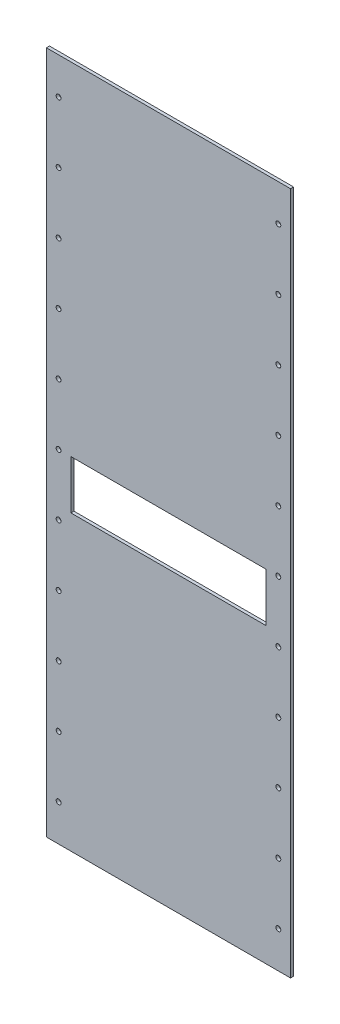
ISO-10303-21;
HEADER;
FILE_DESCRIPTION(('STEP AP214'),'2;1');
FILE_NAME('part.step','',(''),(''),'','','');
FILE_SCHEMA(('AUTOMOTIVE_DESIGN { 1 0 10303 214 1 1 1 1 }'));
ENDSEC;
DATA;
#1=APPLICATION_CONTEXT('core data for automotive mechanical design processes');
#2=APPLICATION_PROTOCOL_DEFINITION('international standard','automotive_design',2000,#1);
#3=PRODUCT_CONTEXT('',#1,'mechanical');
#4=PRODUCT('Part','Part','',(#3));
#5=PRODUCT_RELATED_PRODUCT_CATEGORY('part','',(#4));
#6=PRODUCT_DEFINITION_FORMATION('','',#4);
#7=PRODUCT_DEFINITION_CONTEXT('part definition',#1,'design');
#8=PRODUCT_DEFINITION('design','',#6,#7);
#9=PRODUCT_DEFINITION_SHAPE('','',#8);
#10=(LENGTH_UNIT() NAMED_UNIT(*) SI_UNIT(.MILLI.,.METRE.));
#11=(NAMED_UNIT(*) PLANE_ANGLE_UNIT() SI_UNIT($,.RADIAN.));
#12=(NAMED_UNIT(*) SI_UNIT($,.STERADIAN.) SOLID_ANGLE_UNIT());
#13=UNCERTAINTY_MEASURE_WITH_UNIT(LENGTH_MEASURE(1.E-05),#10,'distance_accuracy_value','');
#14=(GEOMETRIC_REPRESENTATION_CONTEXT(3) GLOBAL_UNCERTAINTY_ASSIGNED_CONTEXT((#13)) GLOBAL_UNIT_ASSIGNED_CONTEXT((#10,
#11,#12)) REPRESENTATION_CONTEXT('',''));
#15=CARTESIAN_POINT('',(0.,0.,0.));
#16=DIRECTION('',(0.,0.,1.));
#17=DIRECTION('',(1.,0.,0.));
#18=AXIS2_PLACEMENT_3D('',#15,#16,#17);
#19=CARTESIAN_POINT('',(-12.7,38.0999999999999,3.175));
#20=DIRECTION('',(0.,0.,1.));
#21=DIRECTION('',(1.,0.,0.));
#22=AXIS2_PLACEMENT_3D('',#19,#20,#21);
#23=CYLINDRICAL_SURFACE('',#22,2.55269999999999);
#24=CARTESIAN_POINT('',(-12.7,38.0999999999999,0.));
#25=DIRECTION('',(0.,0.,1.));
#26=DIRECTION('',(1.,0.,0.));
#27=AXIS2_PLACEMENT_3D('',#24,#25,#26);
#28=CIRCLE('',#27,2.55269999999999);
#29=CARTESIAN_POINT('',(-10.1473,38.0999999999999,0.));
#30=VERTEX_POINT('',#29);
#31=EDGE_CURVE('E46',#30,#30,#28,.F.);
#32=ORIENTED_EDGE('',*,*,#31,.T.);
#33=EDGE_LOOP('',(#32));
#34=FACE_BOUND('',#33,.T.);
#35=CARTESIAN_POINT('',(-12.7,38.0999999999999,3.175));
#36=DIRECTION('',(0.,0.,1.));
#37=DIRECTION('',(1.,0.,0.));
#38=AXIS2_PLACEMENT_3D('',#35,#36,#37);
#39=CIRCLE('',#38,2.55269999999999);
#40=CARTESIAN_POINT('',(-10.1473,38.0999999999999,3.175));
#41=VERTEX_POINT('',#40);
#42=EDGE_CURVE('E11',#41,#41,#39,.T.);
#43=ORIENTED_EDGE('',*,*,#42,.T.);
#44=EDGE_LOOP('',(#43));
#45=FACE_BOUND('',#44,.T.);
#46=ADVANCED_FACE('F38',(#34,#45),#23,.F.);
#47=CARTESIAN_POINT('',(-12.7,101.6,3.175));
#48=DIRECTION('',(0.,0.,1.));
#49=DIRECTION('',(1.,0.,0.));
#50=AXIS2_PLACEMENT_3D('',#47,#48,#49);
#51=CYLINDRICAL_SURFACE('',#50,2.55269999999999);
#52=CARTESIAN_POINT('',(-12.7,101.6,0.));
#53=DIRECTION('',(0.,0.,1.));
#54=DIRECTION('',(1.,0.,0.));
#55=AXIS2_PLACEMENT_3D('',#52,#53,#54);
#56=CIRCLE('',#55,2.55269999999999);
#57=CARTESIAN_POINT('',(-10.1473,101.6,0.));
#58=VERTEX_POINT('',#57);
#59=EDGE_CURVE('E353',#58,#58,#56,.F.);
#60=ORIENTED_EDGE('',*,*,#59,.T.);
#61=EDGE_LOOP('',(#60));
#62=FACE_BOUND('',#61,.T.);
#63=CARTESIAN_POINT('',(-12.7,101.6,3.175));
#64=DIRECTION('',(0.,0.,1.));
#65=DIRECTION('',(1.,0.,0.));
#66=AXIS2_PLACEMENT_3D('',#63,#64,#65);
#67=CIRCLE('',#66,2.55269999999999);
#68=CARTESIAN_POINT('',(-10.1473,101.6,3.175));
#69=VERTEX_POINT('',#68);
#70=EDGE_CURVE('E357',#69,#69,#67,.T.);
#71=ORIENTED_EDGE('',*,*,#70,.T.);
#72=EDGE_LOOP('',(#71));
#73=FACE_BOUND('',#72,.T.);
#74=ADVANCED_FACE('F388',(#62,#73),#51,.F.);
#75=CARTESIAN_POINT('',(-12.7,165.1,3.175));
#76=DIRECTION('',(0.,0.,1.));
#77=DIRECTION('',(1.,0.,0.));
#78=AXIS2_PLACEMENT_3D('',#75,#76,#77);
#79=CYLINDRICAL_SURFACE('',#78,2.55269999999999);
#80=CARTESIAN_POINT('',(-12.7,165.1,0.));
#81=DIRECTION('',(0.,0.,1.));
#82=DIRECTION('',(1.,0.,0.));
#83=AXIS2_PLACEMENT_3D('',#80,#81,#82);
#84=CIRCLE('',#83,2.55269999999999);
#85=CARTESIAN_POINT('',(-10.1473,165.1,0.));
#86=VERTEX_POINT('',#85);
#87=EDGE_CURVE('E345',#86,#86,#84,.F.);
#88=ORIENTED_EDGE('',*,*,#87,.T.);
#89=EDGE_LOOP('',(#88));
#90=FACE_BOUND('',#89,.T.);
#91=CARTESIAN_POINT('',(-12.7,165.1,3.175));
#92=DIRECTION('',(0.,0.,1.));
#93=DIRECTION('',(1.,0.,0.));
#94=AXIS2_PLACEMENT_3D('',#91,#92,#93);
#95=CIRCLE('',#94,2.55269999999999);
#96=CARTESIAN_POINT('',(-10.1473,165.1,3.175));
#97=VERTEX_POINT('',#96);
#98=EDGE_CURVE('E349',#97,#97,#95,.T.);
#99=ORIENTED_EDGE('',*,*,#98,.T.);
#100=EDGE_LOOP('',(#99));
#101=FACE_BOUND('',#100,.T.);
#102=ADVANCED_FACE('F392',(#90,#101),#79,.F.);
#103=CARTESIAN_POINT('',(-12.7,228.6,3.175));
#104=DIRECTION('',(0.,0.,1.));
#105=DIRECTION('',(1.,0.,0.));
#106=AXIS2_PLACEMENT_3D('',#103,#104,#105);
#107=CYLINDRICAL_SURFACE('',#106,2.55269999999999);
#108=CARTESIAN_POINT('',(-12.7,228.6,0.));
#109=DIRECTION('',(0.,0.,1.));
#110=DIRECTION('',(1.,0.,0.));
#111=AXIS2_PLACEMENT_3D('',#108,#109,#110);
#112=CIRCLE('',#111,2.55269999999999);
#113=CARTESIAN_POINT('',(-10.1473,228.6,0.));
#114=VERTEX_POINT('',#113);
#115=EDGE_CURVE('E337',#114,#114,#112,.F.);
#116=ORIENTED_EDGE('',*,*,#115,.T.);
#117=EDGE_LOOP('',(#116));
#118=FACE_BOUND('',#117,.T.);
#119=CARTESIAN_POINT('',(-12.7,228.6,3.175));
#120=DIRECTION('',(0.,0.,1.));
#121=DIRECTION('',(1.,0.,0.));
#122=AXIS2_PLACEMENT_3D('',#119,#120,#121);
#123=CIRCLE('',#122,2.55269999999999);
#124=CARTESIAN_POINT('',(-10.1473,228.6,3.175));
#125=VERTEX_POINT('',#124);
#126=EDGE_CURVE('E341',#125,#125,#123,.T.);
#127=ORIENTED_EDGE('',*,*,#126,.T.);
#128=EDGE_LOOP('',(#127));
#129=FACE_BOUND('',#128,.T.);
#130=ADVANCED_FACE('F397',(#118,#129),#107,.F.);
#131=CARTESIAN_POINT('',(-12.7,292.1,3.175));
#132=DIRECTION('',(0.,0.,1.));
#133=DIRECTION('',(1.,0.,0.));
#134=AXIS2_PLACEMENT_3D('',#131,#132,#133);
#135=CYLINDRICAL_SURFACE('',#134,2.55269999999999);
#136=CARTESIAN_POINT('',(-12.7,292.1,0.));
#137=DIRECTION('',(0.,0.,1.));
#138=DIRECTION('',(1.,0.,0.));
#139=AXIS2_PLACEMENT_3D('',#136,#137,#138);
#140=CIRCLE('',#139,2.55269999999999);
#141=CARTESIAN_POINT('',(-10.1473,292.1,0.));
#142=VERTEX_POINT('',#141);
#143=EDGE_CURVE('E329',#142,#142,#140,.F.);
#144=ORIENTED_EDGE('',*,*,#143,.T.);
#145=EDGE_LOOP('',(#144));
#146=FACE_BOUND('',#145,.T.);
#147=CARTESIAN_POINT('',(-12.7,292.1,3.175));
#148=DIRECTION('',(0.,0.,1.));
#149=DIRECTION('',(1.,0.,0.));
#150=AXIS2_PLACEMENT_3D('',#147,#148,#149);
#151=CIRCLE('',#150,2.55269999999999);
#152=CARTESIAN_POINT('',(-10.1473,292.1,3.175));
#153=VERTEX_POINT('',#152);
#154=EDGE_CURVE('E333',#153,#153,#151,.T.);
#155=ORIENTED_EDGE('',*,*,#154,.T.);
#156=EDGE_LOOP('',(#155));
#157=FACE_BOUND('',#156,.T.);
#158=ADVANCED_FACE('F404',(#146,#157),#135,.F.);
#159=CARTESIAN_POINT('',(-12.7,355.6,3.175));
#160=DIRECTION('',(0.,0.,1.));
#161=DIRECTION('',(1.,0.,0.));
#162=AXIS2_PLACEMENT_3D('',#159,#160,#161);
#163=CYLINDRICAL_SURFACE('',#162,2.55269999999999);
#164=CARTESIAN_POINT('',(-12.7,355.6,0.));
#165=DIRECTION('',(0.,0.,1.));
#166=DIRECTION('',(1.,0.,0.));
#167=AXIS2_PLACEMENT_3D('',#164,#165,#166);
#168=CIRCLE('',#167,2.55269999999999);
#169=CARTESIAN_POINT('',(-10.1473,355.6,0.));
#170=VERTEX_POINT('',#169);
#171=EDGE_CURVE('E321',#170,#170,#168,.F.);
#172=ORIENTED_EDGE('',*,*,#171,.T.);
#173=EDGE_LOOP('',(#172));
#174=FACE_BOUND('',#173,.T.);
#175=CARTESIAN_POINT('',(-12.7,355.6,3.175));
#176=DIRECTION('',(0.,0.,1.));
#177=DIRECTION('',(1.,0.,0.));
#178=AXIS2_PLACEMENT_3D('',#175,#176,#177);
#179=CIRCLE('',#178,2.55269999999999);
#180=CARTESIAN_POINT('',(-10.1473,355.6,3.175));
#181=VERTEX_POINT('',#180);
#182=EDGE_CURVE('E325',#181,#181,#179,.T.);
#183=ORIENTED_EDGE('',*,*,#182,.T.);
#184=EDGE_LOOP('',(#183));
#185=FACE_BOUND('',#184,.T.);
#186=ADVANCED_FACE('F408',(#174,#185),#163,.F.);
#187=CARTESIAN_POINT('',(-12.7,419.1,3.175));
#188=DIRECTION('',(0.,0.,1.));
#189=DIRECTION('',(1.,0.,0.));
#190=AXIS2_PLACEMENT_3D('',#187,#188,#189);
#191=CYLINDRICAL_SURFACE('',#190,2.55269999999999);
#192=CARTESIAN_POINT('',(-12.7,419.1,0.));
#193=DIRECTION('',(0.,0.,1.));
#194=DIRECTION('',(1.,0.,0.));
#195=AXIS2_PLACEMENT_3D('',#192,#193,#194);
#196=CIRCLE('',#195,2.55269999999999);
#197=CARTESIAN_POINT('',(-10.1473,419.1,0.));
#198=VERTEX_POINT('',#197);
#199=EDGE_CURVE('E313',#198,#198,#196,.F.);
#200=ORIENTED_EDGE('',*,*,#199,.T.);
#201=EDGE_LOOP('',(#200));
#202=FACE_BOUND('',#201,.T.);
#203=CARTESIAN_POINT('',(-12.7,419.1,3.175));
#204=DIRECTION('',(0.,0.,1.));
#205=DIRECTION('',(1.,0.,0.));
#206=AXIS2_PLACEMENT_3D('',#203,#204,#205);
#207=CIRCLE('',#206,2.55269999999999);
#208=CARTESIAN_POINT('',(-10.1473,419.1,3.175));
#209=VERTEX_POINT('',#208);
#210=EDGE_CURVE('E317',#209,#209,#207,.T.);
#211=ORIENTED_EDGE('',*,*,#210,.T.);
#212=EDGE_LOOP('',(#211));
#213=FACE_BOUND('',#212,.T.);
#214=ADVANCED_FACE('F412',(#202,#213),#191,.F.);
#215=CARTESIAN_POINT('',(-12.7,482.6,3.175));
#216=DIRECTION('',(0.,0.,1.));
#217=DIRECTION('',(1.,0.,0.));
#218=AXIS2_PLACEMENT_3D('',#215,#216,#217);
#219=CYLINDRICAL_SURFACE('',#218,2.55269999999999);
#220=CARTESIAN_POINT('',(-12.7,482.6,0.));
#221=DIRECTION('',(0.,0.,1.));
#222=DIRECTION('',(1.,0.,0.));
#223=AXIS2_PLACEMENT_3D('',#220,#221,#222);
#224=CIRCLE('',#223,2.55269999999999);
#225=CARTESIAN_POINT('',(-10.1473,482.6,0.));
#226=VERTEX_POINT('',#225);
#227=EDGE_CURVE('E305',#226,#226,#224,.F.);
#228=ORIENTED_EDGE('',*,*,#227,.T.);
#229=EDGE_LOOP('',(#228));
#230=FACE_BOUND('',#229,.T.);
#231=CARTESIAN_POINT('',(-12.7,482.6,3.175));
#232=DIRECTION('',(0.,0.,1.));
#233=DIRECTION('',(1.,0.,0.));
#234=AXIS2_PLACEMENT_3D('',#231,#232,#233);
#235=CIRCLE('',#234,2.55269999999999);
#236=CARTESIAN_POINT('',(-10.1473,482.6,3.175));
#237=VERTEX_POINT('',#236);
#238=EDGE_CURVE('E309',#237,#237,#235,.T.);
#239=ORIENTED_EDGE('',*,*,#238,.T.);
#240=EDGE_LOOP('',(#239));
#241=FACE_BOUND('',#240,.T.);
#242=ADVANCED_FACE('F416',(#230,#241),#219,.F.);
#243=CARTESIAN_POINT('',(-12.7,546.1,3.175));
#244=DIRECTION('',(0.,0.,1.));
#245=DIRECTION('',(1.,0.,0.));
#246=AXIS2_PLACEMENT_3D('',#243,#244,#245);
#247=CYLINDRICAL_SURFACE('',#246,2.55269999999999);
#248=CARTESIAN_POINT('',(-12.7,546.1,0.));
#249=DIRECTION('',(0.,0.,1.));
#250=DIRECTION('',(1.,0.,0.));
#251=AXIS2_PLACEMENT_3D('',#248,#249,#250);
#252=CIRCLE('',#251,2.55269999999999);
#253=CARTESIAN_POINT('',(-10.1473,546.1,0.));
#254=VERTEX_POINT('',#253);
#255=EDGE_CURVE('E297',#254,#254,#252,.F.);
#256=ORIENTED_EDGE('',*,*,#255,.T.);
#257=EDGE_LOOP('',(#256));
#258=FACE_BOUND('',#257,.T.);
#259=CARTESIAN_POINT('',(-12.7,546.1,3.175));
#260=DIRECTION('',(0.,0.,1.));
#261=DIRECTION('',(1.,0.,0.));
#262=AXIS2_PLACEMENT_3D('',#259,#260,#261);
#263=CIRCLE('',#262,2.55269999999999);
#264=CARTESIAN_POINT('',(-10.1473,546.1,3.175));
#265=VERTEX_POINT('',#264);
#266=EDGE_CURVE('E301',#265,#265,#263,.T.);
#267=ORIENTED_EDGE('',*,*,#266,.T.);
#268=EDGE_LOOP('',(#267));
#269=FACE_BOUND('',#268,.T.);
#270=ADVANCED_FACE('F420',(#258,#269),#247,.F.);
#271=CARTESIAN_POINT('',(-241.3,38.0999999999999,3.175));
#272=DIRECTION('',(0.,0.,1.));
#273=DIRECTION('',(1.,0.,0.));
#274=AXIS2_PLACEMENT_3D('',#271,#272,#273);
#275=CYLINDRICAL_SURFACE('',#274,2.55269999999999);
#276=CARTESIAN_POINT('',(-241.3,38.0999999999999,0.));
#277=DIRECTION('',(0.,0.,1.));
#278=DIRECTION('',(1.,0.,0.));
#279=AXIS2_PLACEMENT_3D('',#276,#277,#278);
#280=CIRCLE('',#279,2.55269999999999);
#281=CARTESIAN_POINT('',(-238.7473,38.0999999999999,0.));
#282=VERTEX_POINT('',#281);
#283=EDGE_CURVE('E289',#282,#282,#280,.F.);
#284=ORIENTED_EDGE('',*,*,#283,.T.);
#285=EDGE_LOOP('',(#284));
#286=FACE_BOUND('',#285,.T.);
#287=CARTESIAN_POINT('',(-241.3,38.0999999999999,3.175));
#288=DIRECTION('',(0.,0.,1.));
#289=DIRECTION('',(1.,0.,0.));
#290=AXIS2_PLACEMENT_3D('',#287,#288,#289);
#291=CIRCLE('',#290,2.55269999999999);
#292=CARTESIAN_POINT('',(-238.7473,38.0999999999999,3.175));
#293=VERTEX_POINT('',#292);
#294=EDGE_CURVE('E293',#293,#293,#291,.T.);
#295=ORIENTED_EDGE('',*,*,#294,.T.);
#296=EDGE_LOOP('',(#295));
#297=FACE_BOUND('',#296,.T.);
#298=ADVANCED_FACE('F424',(#286,#297),#275,.F.);
#299=CARTESIAN_POINT('',(-241.3,101.6,3.175));
#300=DIRECTION('',(0.,0.,1.));
#301=DIRECTION('',(1.,0.,0.));
#302=AXIS2_PLACEMENT_3D('',#299,#300,#301);
#303=CYLINDRICAL_SURFACE('',#302,2.55269999999999);
#304=CARTESIAN_POINT('',(-241.3,101.6,0.));
#305=DIRECTION('',(0.,0.,1.));
#306=DIRECTION('',(1.,0.,0.));
#307=AXIS2_PLACEMENT_3D('',#304,#305,#306);
#308=CIRCLE('',#307,2.55269999999999);
#309=CARTESIAN_POINT('',(-238.7473,101.6,0.));
#310=VERTEX_POINT('',#309);
#311=EDGE_CURVE('E281',#310,#310,#308,.F.);
#312=ORIENTED_EDGE('',*,*,#311,.T.);
#313=EDGE_LOOP('',(#312));
#314=FACE_BOUND('',#313,.T.);
#315=CARTESIAN_POINT('',(-241.3,101.6,3.175));
#316=DIRECTION('',(0.,0.,1.));
#317=DIRECTION('',(1.,0.,0.));
#318=AXIS2_PLACEMENT_3D('',#315,#316,#317);
#319=CIRCLE('',#318,2.55269999999999);
#320=CARTESIAN_POINT('',(-238.7473,101.6,3.175));
#321=VERTEX_POINT('',#320);
#322=EDGE_CURVE('E285',#321,#321,#319,.T.);
#323=ORIENTED_EDGE('',*,*,#322,.T.);
#324=EDGE_LOOP('',(#323));
#325=FACE_BOUND('',#324,.T.);
#326=ADVANCED_FACE('F428',(#314,#325),#303,.F.);
#327=CARTESIAN_POINT('',(-241.3,165.1,3.175));
#328=DIRECTION('',(0.,0.,1.));
#329=DIRECTION('',(1.,0.,0.));
#330=AXIS2_PLACEMENT_3D('',#327,#328,#329);
#331=CYLINDRICAL_SURFACE('',#330,2.55269999999999);
#332=CARTESIAN_POINT('',(-241.3,165.1,0.));
#333=DIRECTION('',(0.,0.,1.));
#334=DIRECTION('',(1.,0.,0.));
#335=AXIS2_PLACEMENT_3D('',#332,#333,#334);
#336=CIRCLE('',#335,2.55269999999999);
#337=CARTESIAN_POINT('',(-238.7473,165.1,0.));
#338=VERTEX_POINT('',#337);
#339=EDGE_CURVE('E273',#338,#338,#336,.F.);
#340=ORIENTED_EDGE('',*,*,#339,.T.);
#341=EDGE_LOOP('',(#340));
#342=FACE_BOUND('',#341,.T.);
#343=CARTESIAN_POINT('',(-241.3,165.1,3.175));
#344=DIRECTION('',(0.,0.,1.));
#345=DIRECTION('',(1.,0.,0.));
#346=AXIS2_PLACEMENT_3D('',#343,#344,#345);
#347=CIRCLE('',#346,2.55269999999999);
#348=CARTESIAN_POINT('',(-238.7473,165.1,3.175));
#349=VERTEX_POINT('',#348);
#350=EDGE_CURVE('E277',#349,#349,#347,.T.);
#351=ORIENTED_EDGE('',*,*,#350,.T.);
#352=EDGE_LOOP('',(#351));
#353=FACE_BOUND('',#352,.T.);
#354=ADVANCED_FACE('F432',(#342,#353),#331,.F.);
#355=CARTESIAN_POINT('',(-241.3,228.6,3.175));
#356=DIRECTION('',(0.,0.,1.));
#357=DIRECTION('',(1.,0.,0.));
#358=AXIS2_PLACEMENT_3D('',#355,#356,#357);
#359=CYLINDRICAL_SURFACE('',#358,2.55269999999999);
#360=CARTESIAN_POINT('',(-241.3,228.6,0.));
#361=DIRECTION('',(0.,0.,1.));
#362=DIRECTION('',(1.,0.,0.));
#363=AXIS2_PLACEMENT_3D('',#360,#361,#362);
#364=CIRCLE('',#363,2.55269999999999);
#365=CARTESIAN_POINT('',(-238.7473,228.6,0.));
#366=VERTEX_POINT('',#365);
#367=EDGE_CURVE('E265',#366,#366,#364,.F.);
#368=ORIENTED_EDGE('',*,*,#367,.T.);
#369=EDGE_LOOP('',(#368));
#370=FACE_BOUND('',#369,.T.);
#371=CARTESIAN_POINT('',(-241.3,228.6,3.175));
#372=DIRECTION('',(0.,0.,1.));
#373=DIRECTION('',(1.,0.,0.));
#374=AXIS2_PLACEMENT_3D('',#371,#372,#373);
#375=CIRCLE('',#374,2.55269999999999);
#376=CARTESIAN_POINT('',(-238.7473,228.6,3.175));
#377=VERTEX_POINT('',#376);
#378=EDGE_CURVE('E269',#377,#377,#375,.T.);
#379=ORIENTED_EDGE('',*,*,#378,.T.);
#380=EDGE_LOOP('',(#379));
#381=FACE_BOUND('',#380,.T.);
#382=ADVANCED_FACE('F436',(#370,#381),#359,.F.);
#383=CARTESIAN_POINT('',(-241.3,292.1,3.175));
#384=DIRECTION('',(0.,0.,1.));
#385=DIRECTION('',(1.,0.,0.));
#386=AXIS2_PLACEMENT_3D('',#383,#384,#385);
#387=CYLINDRICAL_SURFACE('',#386,2.55269999999999);
#388=CARTESIAN_POINT('',(-241.3,292.1,0.));
#389=DIRECTION('',(0.,0.,1.));
#390=DIRECTION('',(1.,0.,0.));
#391=AXIS2_PLACEMENT_3D('',#388,#389,#390);
#392=CIRCLE('',#391,2.55269999999999);
#393=CARTESIAN_POINT('',(-238.7473,292.1,0.));
#394=VERTEX_POINT('',#393);
#395=EDGE_CURVE('E257',#394,#394,#392,.F.);
#396=ORIENTED_EDGE('',*,*,#395,.T.);
#397=EDGE_LOOP('',(#396));
#398=FACE_BOUND('',#397,.T.);
#399=CARTESIAN_POINT('',(-241.3,292.1,3.175));
#400=DIRECTION('',(0.,0.,1.));
#401=DIRECTION('',(1.,0.,0.));
#402=AXIS2_PLACEMENT_3D('',#399,#400,#401);
#403=CIRCLE('',#402,2.55269999999999);
#404=CARTESIAN_POINT('',(-238.7473,292.1,3.175));
#405=VERTEX_POINT('',#404);
#406=EDGE_CURVE('E261',#405,#405,#403,.T.);
#407=ORIENTED_EDGE('',*,*,#406,.T.);
#408=EDGE_LOOP('',(#407));
#409=FACE_BOUND('',#408,.T.);
#410=ADVANCED_FACE('F440',(#398,#409),#387,.F.);
#411=CARTESIAN_POINT('',(-241.3,355.6,3.175));
#412=DIRECTION('',(0.,0.,1.));
#413=DIRECTION('',(1.,0.,0.));
#414=AXIS2_PLACEMENT_3D('',#411,#412,#413);
#415=CYLINDRICAL_SURFACE('',#414,2.55269999999999);
#416=CARTESIAN_POINT('',(-241.3,355.6,0.));
#417=DIRECTION('',(0.,0.,1.));
#418=DIRECTION('',(1.,0.,0.));
#419=AXIS2_PLACEMENT_3D('',#416,#417,#418);
#420=CIRCLE('',#419,2.55269999999999);
#421=CARTESIAN_POINT('',(-238.7473,355.6,0.));
#422=VERTEX_POINT('',#421);
#423=EDGE_CURVE('E249',#422,#422,#420,.F.);
#424=ORIENTED_EDGE('',*,*,#423,.T.);
#425=EDGE_LOOP('',(#424));
#426=FACE_BOUND('',#425,.T.);
#427=CARTESIAN_POINT('',(-241.3,355.6,3.175));
#428=DIRECTION('',(0.,0.,1.));
#429=DIRECTION('',(1.,0.,0.));
#430=AXIS2_PLACEMENT_3D('',#427,#428,#429);
#431=CIRCLE('',#430,2.55269999999999);
#432=CARTESIAN_POINT('',(-238.7473,355.6,3.175));
#433=VERTEX_POINT('',#432);
#434=EDGE_CURVE('E253',#433,#433,#431,.T.);
#435=ORIENTED_EDGE('',*,*,#434,.T.);
#436=EDGE_LOOP('',(#435));
#437=FACE_BOUND('',#436,.T.);
#438=ADVANCED_FACE('F444',(#426,#437),#415,.F.);
#439=CARTESIAN_POINT('',(-241.3,419.1,3.175));
#440=DIRECTION('',(0.,0.,1.));
#441=DIRECTION('',(1.,0.,0.));
#442=AXIS2_PLACEMENT_3D('',#439,#440,#441);
#443=CYLINDRICAL_SURFACE('',#442,2.55269999999999);
#444=CARTESIAN_POINT('',(-241.3,419.1,0.));
#445=DIRECTION('',(0.,0.,1.));
#446=DIRECTION('',(1.,0.,0.));
#447=AXIS2_PLACEMENT_3D('',#444,#445,#446);
#448=CIRCLE('',#447,2.55269999999999);
#449=CARTESIAN_POINT('',(-238.7473,419.1,0.));
#450=VERTEX_POINT('',#449);
#451=EDGE_CURVE('E241',#450,#450,#448,.F.);
#452=ORIENTED_EDGE('',*,*,#451,.T.);
#453=EDGE_LOOP('',(#452));
#454=FACE_BOUND('',#453,.T.);
#455=CARTESIAN_POINT('',(-241.3,419.1,3.175));
#456=DIRECTION('',(0.,0.,1.));
#457=DIRECTION('',(1.,0.,0.));
#458=AXIS2_PLACEMENT_3D('',#455,#456,#457);
#459=CIRCLE('',#458,2.55269999999999);
#460=CARTESIAN_POINT('',(-238.7473,419.1,3.175));
#461=VERTEX_POINT('',#460);
#462=EDGE_CURVE('E245',#461,#461,#459,.T.);
#463=ORIENTED_EDGE('',*,*,#462,.T.);
#464=EDGE_LOOP('',(#463));
#465=FACE_BOUND('',#464,.T.);
#466=ADVANCED_FACE('F448',(#454,#465),#443,.F.);
#467=CARTESIAN_POINT('',(-241.3,482.6,3.175));
#468=DIRECTION('',(0.,0.,1.));
#469=DIRECTION('',(1.,0.,0.));
#470=AXIS2_PLACEMENT_3D('',#467,#468,#469);
#471=CYLINDRICAL_SURFACE('',#470,2.55269999999999);
#472=CARTESIAN_POINT('',(-241.3,482.6,0.));
#473=DIRECTION('',(0.,0.,1.));
#474=DIRECTION('',(1.,0.,0.));
#475=AXIS2_PLACEMENT_3D('',#472,#473,#474);
#476=CIRCLE('',#475,2.55269999999999);
#477=CARTESIAN_POINT('',(-238.7473,482.6,0.));
#478=VERTEX_POINT('',#477);
#479=EDGE_CURVE('E233',#478,#478,#476,.F.);
#480=ORIENTED_EDGE('',*,*,#479,.T.);
#481=EDGE_LOOP('',(#480));
#482=FACE_BOUND('',#481,.T.);
#483=CARTESIAN_POINT('',(-241.3,482.6,3.175));
#484=DIRECTION('',(0.,0.,1.));
#485=DIRECTION('',(1.,0.,0.));
#486=AXIS2_PLACEMENT_3D('',#483,#484,#485);
#487=CIRCLE('',#486,2.55269999999999);
#488=CARTESIAN_POINT('',(-238.7473,482.6,3.175));
#489=VERTEX_POINT('',#488);
#490=EDGE_CURVE('E237',#489,#489,#487,.T.);
#491=ORIENTED_EDGE('',*,*,#490,.T.);
#492=EDGE_LOOP('',(#491));
#493=FACE_BOUND('',#492,.T.);
#494=ADVANCED_FACE('F381',(#482,#493),#471,.F.);
#495=CARTESIAN_POINT('',(-241.3,546.1,3.175));
#496=DIRECTION('',(0.,0.,1.));
#497=DIRECTION('',(1.,0.,0.));
#498=AXIS2_PLACEMENT_3D('',#495,#496,#497);
#499=CYLINDRICAL_SURFACE('',#498,2.55269999999999);
#500=CARTESIAN_POINT('',(-241.3,546.1,0.));
#501=DIRECTION('',(0.,0.,1.));
#502=DIRECTION('',(1.,0.,0.));
#503=AXIS2_PLACEMENT_3D('',#500,#501,#502);
#504=CIRCLE('',#503,2.55269999999999);
#505=CARTESIAN_POINT('',(-238.7473,546.1,0.));
#506=VERTEX_POINT('',#505);
#507=EDGE_CURVE('E225',#506,#506,#504,.F.);
#508=ORIENTED_EDGE('',*,*,#507,.T.);
#509=EDGE_LOOP('',(#508));
#510=FACE_BOUND('',#509,.T.);
#511=CARTESIAN_POINT('',(-241.3,546.1,3.175));
#512=DIRECTION('',(0.,0.,1.));
#513=DIRECTION('',(1.,0.,0.));
#514=AXIS2_PLACEMENT_3D('',#511,#512,#513);
#515=CIRCLE('',#514,2.55269999999999);
#516=CARTESIAN_POINT('',(-238.7473,546.1,3.175));
#517=VERTEX_POINT('',#516);
#518=EDGE_CURVE('E229',#517,#517,#515,.T.);
#519=ORIENTED_EDGE('',*,*,#518,.T.);
#520=EDGE_LOOP('',(#519));
#521=FACE_BOUND('',#520,.T.);
#522=ADVANCED_FACE('F369',(#510,#521),#499,.F.);
#523=CARTESIAN_POINT('',(0.,0.,0.));
#524=DIRECTION('',(0.,0.,1.));
#525=DIRECTION('',(1.,0.,0.));
#526=AXIS2_PLACEMENT_3D('',#523,#524,#525);
#527=PLANE('',#526);
#528=DIRECTION('',(-1.,0.,0.));
#529=VECTOR('',#528,1.);
#530=CARTESIAN_POINT('',(-25.4,304.8,0.));
#531=LINE('',#530,#529);
#532=CARTESIAN_POINT('',(-25.4,304.8,0.));
#533=VERTEX_POINT('',#532);
#534=CARTESIAN_POINT('',(-228.6,304.8,0.));
#535=VERTEX_POINT('',#534);
#536=EDGE_CURVE('E137',#533,#535,#531,.T.);
#537=ORIENTED_EDGE('',*,*,#536,.F.);
#538=DIRECTION('',(0.,-1.,0.));
#539=VECTOR('',#538,1.);
#540=CARTESIAN_POINT('',(-25.4,304.8,0.));
#541=LINE('',#540,#539);
#542=CARTESIAN_POINT('',(-25.4,355.6,0.));
#543=VERTEX_POINT('',#542);
#544=EDGE_CURVE('E53',#543,#533,#541,.T.);
#545=ORIENTED_EDGE('',*,*,#544,.F.);
#546=DIRECTION('',(1.,0.,0.));
#547=VECTOR('',#546,1.);
#548=CARTESIAN_POINT('',(-25.4,355.6,0.));
#549=LINE('',#548,#547);
#550=CARTESIAN_POINT('',(-228.6,355.6,0.));
#551=VERTEX_POINT('',#550);
#552=EDGE_CURVE('E124',#551,#543,#549,.T.);
#553=ORIENTED_EDGE('',*,*,#552,.F.);
#554=DIRECTION('',(0.,1.,0.));
#555=VECTOR('',#554,1.);
#556=CARTESIAN_POINT('',(-228.6,304.8,0.));
#557=LINE('',#556,#555);
#558=EDGE_CURVE('E128',#535,#551,#557,.T.);
#559=ORIENTED_EDGE('',*,*,#558,.F.);
#560=EDGE_LOOP('',(#537,#545,#553,#559));
#561=FACE_BOUND('',#560,.T.);
#562=CARTESIAN_POINT('',(-12.7,609.6,0.));
#563=DIRECTION('',(0.,0.,1.));
#564=DIRECTION('',(1.,0.,0.));
#565=AXIS2_PLACEMENT_3D('',#562,#563,#564);
#566=CIRCLE('',#565,2.55269999999999);
#567=CARTESIAN_POINT('',(-10.1473,609.6,0.));
#568=VERTEX_POINT('',#567);
#569=EDGE_CURVE('E146',#568,#568,#566,.F.);
#570=ORIENTED_EDGE('',*,*,#569,.F.);
#571=EDGE_LOOP('',(#570));
#572=FACE_BOUND('',#571,.T.);
#573=CARTESIAN_POINT('',(-241.3,609.6,0.));
#574=DIRECTION('',(0.,0.,1.));
#575=DIRECTION('',(1.,0.,0.));
#576=AXIS2_PLACEMENT_3D('',#573,#574,#575);
#577=CIRCLE('',#576,2.55269999999999);
#578=CARTESIAN_POINT('',(-238.7473,609.6,0.));
#579=VERTEX_POINT('',#578);
#580=EDGE_CURVE('E159',#579,#579,#577,.F.);
#581=ORIENTED_EDGE('',*,*,#580,.F.);
#582=EDGE_LOOP('',(#581));
#583=FACE_BOUND('',#582,.T.);
#584=CARTESIAN_POINT('',(-12.7,673.1,0.));
#585=DIRECTION('',(0.,0.,1.));
#586=DIRECTION('',(1.,0.,0.));
#587=AXIS2_PLACEMENT_3D('',#584,#585,#586);
#588=CIRCLE('',#587,2.55269999999999);
#589=CARTESIAN_POINT('',(-10.1473,673.1,0.));
#590=VERTEX_POINT('',#589);
#591=EDGE_CURVE('E176',#590,#590,#588,.F.);
#592=ORIENTED_EDGE('',*,*,#591,.F.);
#593=EDGE_LOOP('',(#592));
#594=FACE_BOUND('',#593,.T.);
#595=DIRECTION('',(0.,1.,0.));
#596=VECTOR('',#595,1.);
#597=CARTESIAN_POINT('',(0.,0.,0.));
#598=LINE('',#597,#596);
#599=CARTESIAN_POINT('',(0.,0.,0.));
#600=VERTEX_POINT('',#599);
#601=CARTESIAN_POINT('',(0.,711.2,0.));
#602=VERTEX_POINT('',#601);
#603=EDGE_CURVE('E180',#600,#602,#598,.T.);
#604=ORIENTED_EDGE('',*,*,#603,.F.);
#605=DIRECTION('',(1.,0.,0.));
#606=VECTOR('',#605,1.);
#607=CARTESIAN_POINT('',(0.,0.,0.));
#608=LINE('',#607,#606);
#609=CARTESIAN_POINT('',(-254.,0.,0.));
#610=VERTEX_POINT('',#609);
#611=EDGE_CURVE('E189',#610,#600,#608,.T.);
#612=ORIENTED_EDGE('',*,*,#611,.F.);
#613=DIRECTION('',(0.,-1.,0.));
#614=VECTOR('',#613,1.);
#615=CARTESIAN_POINT('',(-254.,0.,0.));
#616=LINE('',#615,#614);
#617=CARTESIAN_POINT('',(-254.,711.2,0.));
#618=VERTEX_POINT('',#617);
#619=EDGE_CURVE('E205',#618,#610,#616,.T.);
#620=ORIENTED_EDGE('',*,*,#619,.F.);
#621=DIRECTION('',(-1.,0.,0.));
#622=VECTOR('',#621,1.);
#623=CARTESIAN_POINT('',(0.,711.2,0.));
#624=LINE('',#623,#622);
#625=EDGE_CURVE('E202',#602,#618,#624,.T.);
#626=ORIENTED_EDGE('',*,*,#625,.F.);
#627=EDGE_LOOP('',(#604,#612,#620,#626));
#628=FACE_BOUND('',#627,.T.);
#629=CARTESIAN_POINT('',(-241.3,673.1,0.));
#630=DIRECTION('',(0.,0.,1.));
#631=DIRECTION('',(1.,0.,0.));
#632=AXIS2_PLACEMENT_3D('',#629,#630,#631);
#633=CIRCLE('',#632,2.55269999999999);
#634=CARTESIAN_POINT('',(-238.7473,673.1,0.));
#635=VERTEX_POINT('',#634);
#636=EDGE_CURVE('E168',#635,#635,#633,.F.);
#637=ORIENTED_EDGE('',*,*,#636,.F.);
#638=EDGE_LOOP('',(#637));
#639=FACE_BOUND('',#638,.T.);
#640=ORIENTED_EDGE('',*,*,#507,.F.);
#641=EDGE_LOOP('',(#640));
#642=FACE_BOUND('',#641,.T.);
#643=ORIENTED_EDGE('',*,*,#479,.F.);
#644=EDGE_LOOP('',(#643));
#645=FACE_BOUND('',#644,.T.);
#646=ORIENTED_EDGE('',*,*,#451,.F.);
#647=EDGE_LOOP('',(#646));
#648=FACE_BOUND('',#647,.T.);
#649=ORIENTED_EDGE('',*,*,#423,.F.);
#650=EDGE_LOOP('',(#649));
#651=FACE_BOUND('',#650,.T.);
#652=ORIENTED_EDGE('',*,*,#395,.F.);
#653=EDGE_LOOP('',(#652));
#654=FACE_BOUND('',#653,.T.);
#655=ORIENTED_EDGE('',*,*,#367,.F.);
#656=EDGE_LOOP('',(#655));
#657=FACE_BOUND('',#656,.T.);
#658=ORIENTED_EDGE('',*,*,#339,.F.);
#659=EDGE_LOOP('',(#658));
#660=FACE_BOUND('',#659,.T.);
#661=ORIENTED_EDGE('',*,*,#311,.F.);
#662=EDGE_LOOP('',(#661));
#663=FACE_BOUND('',#662,.T.);
#664=ORIENTED_EDGE('',*,*,#283,.F.);
#665=EDGE_LOOP('',(#664));
#666=FACE_BOUND('',#665,.T.);
#667=ORIENTED_EDGE('',*,*,#255,.F.);
#668=EDGE_LOOP('',(#667));
#669=FACE_BOUND('',#668,.T.);
#670=ORIENTED_EDGE('',*,*,#227,.F.);
#671=EDGE_LOOP('',(#670));
#672=FACE_BOUND('',#671,.T.);
#673=ORIENTED_EDGE('',*,*,#199,.F.);
#674=EDGE_LOOP('',(#673));
#675=FACE_BOUND('',#674,.T.);
#676=ORIENTED_EDGE('',*,*,#171,.F.);
#677=EDGE_LOOP('',(#676));
#678=FACE_BOUND('',#677,.T.);
#679=ORIENTED_EDGE('',*,*,#143,.F.);
#680=EDGE_LOOP('',(#679));
#681=FACE_BOUND('',#680,.T.);
#682=ORIENTED_EDGE('',*,*,#115,.F.);
#683=EDGE_LOOP('',(#682));
#684=FACE_BOUND('',#683,.T.);
#685=ORIENTED_EDGE('',*,*,#87,.F.);
#686=EDGE_LOOP('',(#685));
#687=FACE_BOUND('',#686,.T.);
#688=ORIENTED_EDGE('',*,*,#59,.F.);
#689=EDGE_LOOP('',(#688));
#690=FACE_BOUND('',#689,.T.);
#691=ORIENTED_EDGE('',*,*,#31,.F.);
#692=EDGE_LOOP('',(#691));
#693=FACE_BOUND('',#692,.T.);
#694=ADVANCED_FACE('F366',(#561,#572,#583,#594,#628,#639,#642,#645,#648,#651,#654,#657,#660,
#663,#666,#669,#672,#675,#678,#681,#684,#687,#690,#693),#527,.F.);
#695=CARTESIAN_POINT('',(0.,0.,3.175));
#696=DIRECTION('',(-1.,0.,0.));
#697=DIRECTION('',(0.,0.,1.));
#698=AXIS2_PLACEMENT_3D('',#695,#696,#697);
#699=PLANE('',#698);
#700=ORIENTED_EDGE('',*,*,#603,.T.);
#701=DIRECTION('',(0.,0.,-1.));
#702=VECTOR('',#701,1.);
#703=CARTESIAN_POINT('',(0.,711.2,3.175));
#704=LINE('',#703,#702);
#705=CARTESIAN_POINT('',(0.,711.2,3.175));
#706=VERTEX_POINT('',#705);
#707=EDGE_CURVE('E221',#706,#602,#704,.T.);
#708=ORIENTED_EDGE('',*,*,#707,.F.);
#709=DIRECTION('',(0.,1.,0.));
#710=VECTOR('',#709,1.);
#711=CARTESIAN_POINT('',(0.,0.,3.175));
#712=LINE('',#711,#710);
#713=CARTESIAN_POINT('',(0.,0.,3.175));
#714=VERTEX_POINT('',#713);
#715=EDGE_CURVE('E184',#714,#706,#712,.T.);
#716=ORIENTED_EDGE('',*,*,#715,.F.);
#717=DIRECTION('',(0.,0.,-1.));
#718=VECTOR('',#717,1.);
#719=CARTESIAN_POINT('',(0.,0.,3.175));
#720=LINE('',#719,#718);
#721=EDGE_CURVE('E198',#714,#600,#720,.T.);
#722=ORIENTED_EDGE('',*,*,#721,.T.);
#723=EDGE_LOOP('',(#700,#708,#716,#722));
#724=FACE_BOUND('',#723,.T.);
#725=ADVANCED_FACE('F368',(#724),#699,.F.);
#726=CARTESIAN_POINT('',(0.,711.2,3.175));
#727=DIRECTION('',(0.,-1.,0.));
#728=DIRECTION('',(1.,0.,0.));
#729=AXIS2_PLACEMENT_3D('',#726,#727,#728);
#730=PLANE('',#729);
#731=ORIENTED_EDGE('',*,*,#625,.T.);
#732=DIRECTION('',(0.,0.,-1.));
#733=VECTOR('',#732,1.);
#734=CARTESIAN_POINT('',(-254.,711.2,3.175));
#735=LINE('',#734,#733);
#736=CARTESIAN_POINT('',(-254.,711.2,3.175));
#737=VERTEX_POINT('',#736);
#738=EDGE_CURVE('E217',#737,#618,#735,.T.);
#739=ORIENTED_EDGE('',*,*,#738,.F.);
#740=DIRECTION('',(-1.,0.,0.));
#741=VECTOR('',#740,1.);
#742=CARTESIAN_POINT('',(0.,711.2,3.175));
#743=LINE('',#742,#741);
#744=EDGE_CURVE('E188',#706,#737,#743,.T.);
#745=ORIENTED_EDGE('',*,*,#744,.F.);
#746=ORIENTED_EDGE('',*,*,#707,.T.);
#747=EDGE_LOOP('',(#731,#739,#745,#746));
#748=FACE_BOUND('',#747,.T.);
#749=ADVANCED_FACE('F377',(#748),#730,.F.);
#750=CARTESIAN_POINT('',(-254.,0.,3.175));
#751=DIRECTION('',(1.,0.,0.));
#752=DIRECTION('',(0.,0.,-1.));
#753=AXIS2_PLACEMENT_3D('',#750,#751,#752);
#754=PLANE('',#753);
#755=ORIENTED_EDGE('',*,*,#619,.T.);
#756=DIRECTION('',(0.,0.,-1.));
#757=VECTOR('',#756,1.);
#758=CARTESIAN_POINT('',(-254.,0.,3.175));
#759=LINE('',#758,#757);
#760=CARTESIAN_POINT('',(-254.,0.,3.175));
#761=VERTEX_POINT('',#760);
#762=EDGE_CURVE('E213',#761,#610,#759,.T.);
#763=ORIENTED_EDGE('',*,*,#762,.F.);
#764=DIRECTION('',(0.,-1.,0.));
#765=VECTOR('',#764,1.);
#766=CARTESIAN_POINT('',(-254.,0.,3.175));
#767=LINE('',#766,#765);
#768=EDGE_CURVE('E192',#737,#761,#767,.T.);
#769=ORIENTED_EDGE('',*,*,#768,.F.);
#770=ORIENTED_EDGE('',*,*,#738,.T.);
#771=EDGE_LOOP('',(#755,#763,#769,#770));
#772=FACE_BOUND('',#771,.T.);
#773=ADVANCED_FACE('F458',(#772),#754,.F.);
#774=CARTESIAN_POINT('',(0.,0.,3.175));
#775=DIRECTION('',(0.,1.,0.));
#776=DIRECTION('',(0.,0.,1.));
#777=AXIS2_PLACEMENT_3D('',#774,#775,#776);
#778=PLANE('',#777);
#779=ORIENTED_EDGE('',*,*,#611,.T.);
#780=ORIENTED_EDGE('',*,*,#721,.F.);
#781=DIRECTION('',(1.,0.,0.));
#782=VECTOR('',#781,1.);
#783=CARTESIAN_POINT('',(0.,0.,3.175));
#784=LINE('',#783,#782);
#785=EDGE_CURVE('E195',#761,#714,#784,.T.);
#786=ORIENTED_EDGE('',*,*,#785,.F.);
#787=ORIENTED_EDGE('',*,*,#762,.T.);
#788=EDGE_LOOP('',(#779,#780,#786,#787));
#789=FACE_BOUND('',#788,.T.);
#790=ADVANCED_FACE('F461',(#789),#778,.F.);
#791=CARTESIAN_POINT('',(0.,0.,3.175));
#792=DIRECTION('',(0.,0.,1.));
#793=DIRECTION('',(1.,0.,0.));
#794=AXIS2_PLACEMENT_3D('',#791,#792,#793);
#795=PLANE('',#794);
#796=DIRECTION('',(0.,-1.,0.));
#797=VECTOR('',#796,1.);
#798=CARTESIAN_POINT('',(-25.4,304.8,3.175));
#799=LINE('',#798,#797);
#800=CARTESIAN_POINT('',(-25.4,355.6,3.175));
#801=VERTEX_POINT('',#800);
#802=CARTESIAN_POINT('',(-25.4,304.8,3.175));
#803=VERTEX_POINT('',#802);
#804=EDGE_CURVE('E105',#801,#803,#799,.T.);
#805=ORIENTED_EDGE('',*,*,#804,.T.);
#806=DIRECTION('',(-1.,0.,0.));
#807=VECTOR('',#806,1.);
#808=CARTESIAN_POINT('',(-25.4,304.8,3.175));
#809=LINE('',#808,#807);
#810=CARTESIAN_POINT('',(-228.6,304.8,3.175));
#811=VERTEX_POINT('',#810);
#812=EDGE_CURVE('E115',#803,#811,#809,.T.);
#813=ORIENTED_EDGE('',*,*,#812,.T.);
#814=DIRECTION('',(0.,1.,0.));
#815=VECTOR('',#814,1.);
#816=CARTESIAN_POINT('',(-228.6,304.8,3.175));
#817=LINE('',#816,#815);
#818=CARTESIAN_POINT('',(-228.6,355.6,3.175));
#819=VERTEX_POINT('',#818);
#820=EDGE_CURVE('E61',#811,#819,#817,.T.);
#821=ORIENTED_EDGE('',*,*,#820,.T.);
#822=DIRECTION('',(1.,0.,0.));
#823=VECTOR('',#822,1.);
#824=CARTESIAN_POINT('',(-25.4,355.6,3.175));
#825=LINE('',#824,#823);
#826=EDGE_CURVE('E112',#819,#801,#825,.T.);
#827=ORIENTED_EDGE('',*,*,#826,.T.);
#828=EDGE_LOOP('',(#805,#813,#821,#827));
#829=FACE_BOUND('',#828,.T.);
#830=CARTESIAN_POINT('',(-12.7,609.6,3.175));
#831=DIRECTION('',(0.,0.,1.));
#832=DIRECTION('',(1.,0.,0.));
#833=AXIS2_PLACEMENT_3D('',#830,#831,#832);
#834=CIRCLE('',#833,2.55269999999999);
#835=CARTESIAN_POINT('',(-10.1473,609.6,3.175));
#836=VERTEX_POINT('',#835);
#837=EDGE_CURVE('E155',#836,#836,#834,.T.);
#838=ORIENTED_EDGE('',*,*,#837,.F.);
#839=EDGE_LOOP('',(#838));
#840=FACE_BOUND('',#839,.T.);
#841=CARTESIAN_POINT('',(-241.3,609.6,3.175));
#842=DIRECTION('',(0.,0.,1.));
#843=DIRECTION('',(1.,0.,0.));
#844=AXIS2_PLACEMENT_3D('',#841,#842,#843);
#845=CIRCLE('',#844,2.55269999999999);
#846=CARTESIAN_POINT('',(-238.7473,609.6,3.175));
#847=VERTEX_POINT('',#846);
#848=EDGE_CURVE('E163',#847,#847,#845,.T.);
#849=ORIENTED_EDGE('',*,*,#848,.F.);
#850=EDGE_LOOP('',(#849));
#851=FACE_BOUND('',#850,.T.);
#852=CARTESIAN_POINT('',(-241.3,673.1,3.175));
#853=DIRECTION('',(0.,0.,1.));
#854=DIRECTION('',(1.,0.,0.));
#855=AXIS2_PLACEMENT_3D('',#852,#853,#854);
#856=CIRCLE('',#855,2.55269999999999);
#857=CARTESIAN_POINT('',(-238.7473,673.1,3.175));
#858=VERTEX_POINT('',#857);
#859=EDGE_CURVE('E167',#858,#858,#856,.T.);
#860=ORIENTED_EDGE('',*,*,#859,.F.);
#861=EDGE_LOOP('',(#860));
#862=FACE_BOUND('',#861,.T.);
#863=CARTESIAN_POINT('',(-12.7,673.1,3.175));
#864=DIRECTION('',(0.,0.,1.));
#865=DIRECTION('',(1.,0.,0.));
#866=AXIS2_PLACEMENT_3D('',#863,#864,#865);
#867=CIRCLE('',#866,2.55269999999999);
#868=CARTESIAN_POINT('',(-10.1473,673.1,3.175));
#869=VERTEX_POINT('',#868);
#870=EDGE_CURVE('E172',#869,#869,#867,.T.);
#871=ORIENTED_EDGE('',*,*,#870,.F.);
#872=EDGE_LOOP('',(#871));
#873=FACE_BOUND('',#872,.T.);
#874=ORIENTED_EDGE('',*,*,#715,.T.);
#875=ORIENTED_EDGE('',*,*,#744,.T.);
#876=ORIENTED_EDGE('',*,*,#768,.T.);
#877=ORIENTED_EDGE('',*,*,#785,.T.);
#878=EDGE_LOOP('',(#874,#875,#876,#877));
#879=FACE_BOUND('',#878,.T.);
#880=ORIENTED_EDGE('',*,*,#518,.F.);
#881=EDGE_LOOP('',(#880));
#882=FACE_BOUND('',#881,.T.);
#883=ORIENTED_EDGE('',*,*,#490,.F.);
#884=EDGE_LOOP('',(#883));
#885=FACE_BOUND('',#884,.T.);
#886=ORIENTED_EDGE('',*,*,#462,.F.);
#887=EDGE_LOOP('',(#886));
#888=FACE_BOUND('',#887,.T.);
#889=ORIENTED_EDGE('',*,*,#434,.F.);
#890=EDGE_LOOP('',(#889));
#891=FACE_BOUND('',#890,.T.);
#892=ORIENTED_EDGE('',*,*,#406,.F.);
#893=EDGE_LOOP('',(#892));
#894=FACE_BOUND('',#893,.T.);
#895=ORIENTED_EDGE('',*,*,#378,.F.);
#896=EDGE_LOOP('',(#895));
#897=FACE_BOUND('',#896,.T.);
#898=ORIENTED_EDGE('',*,*,#350,.F.);
#899=EDGE_LOOP('',(#898));
#900=FACE_BOUND('',#899,.T.);
#901=ORIENTED_EDGE('',*,*,#322,.F.);
#902=EDGE_LOOP('',(#901));
#903=FACE_BOUND('',#902,.T.);
#904=ORIENTED_EDGE('',*,*,#294,.F.);
#905=EDGE_LOOP('',(#904));
#906=FACE_BOUND('',#905,.T.);
#907=ORIENTED_EDGE('',*,*,#266,.F.);
#908=EDGE_LOOP('',(#907));
#909=FACE_BOUND('',#908,.T.);
#910=ORIENTED_EDGE('',*,*,#238,.F.);
#911=EDGE_LOOP('',(#910));
#912=FACE_BOUND('',#911,.T.);
#913=ORIENTED_EDGE('',*,*,#210,.F.);
#914=EDGE_LOOP('',(#913));
#915=FACE_BOUND('',#914,.T.);
#916=ORIENTED_EDGE('',*,*,#182,.F.);
#917=EDGE_LOOP('',(#916));
#918=FACE_BOUND('',#917,.T.);
#919=ORIENTED_EDGE('',*,*,#154,.F.);
#920=EDGE_LOOP('',(#919));
#921=FACE_BOUND('',#920,.T.);
#922=ORIENTED_EDGE('',*,*,#126,.F.);
#923=EDGE_LOOP('',(#922));
#924=FACE_BOUND('',#923,.T.);
#925=ORIENTED_EDGE('',*,*,#98,.F.);
#926=EDGE_LOOP('',(#925));
#927=FACE_BOUND('',#926,.T.);
#928=ORIENTED_EDGE('',*,*,#70,.F.);
#929=EDGE_LOOP('',(#928));
#930=FACE_BOUND('',#929,.T.);
#931=ORIENTED_EDGE('',*,*,#42,.F.);
#932=EDGE_LOOP('',(#931));
#933=FACE_BOUND('',#932,.T.);
#934=ADVANCED_FACE('F120',(#829,#840,#851,#862,#873,#879,#882,#885,#888,#891,#894,#897,#900,
#903,#906,#909,#912,#915,#918,#921,#924,#927,#930,#933),#795,.T.);
#935=CARTESIAN_POINT('',(-12.7,673.1,3.175));
#936=DIRECTION('',(0.,0.,1.));
#937=DIRECTION('',(1.,0.,0.));
#938=AXIS2_PLACEMENT_3D('',#935,#936,#937);
#939=CYLINDRICAL_SURFACE('',#938,2.55269999999999);
#940=ORIENTED_EDGE('',*,*,#591,.T.);
#941=EDGE_LOOP('',(#940));
#942=FACE_BOUND('',#941,.T.);
#943=ORIENTED_EDGE('',*,*,#870,.T.);
#944=EDGE_LOOP('',(#943));
#945=FACE_BOUND('',#944,.T.);
#946=ADVANCED_FACE('F468',(#942,#945),#939,.F.);
#947=CARTESIAN_POINT('',(-241.3,673.1,3.175));
#948=DIRECTION('',(0.,0.,1.));
#949=DIRECTION('',(1.,0.,0.));
#950=AXIS2_PLACEMENT_3D('',#947,#948,#949);
#951=CYLINDRICAL_SURFACE('',#950,2.55269999999999);
#952=ORIENTED_EDGE('',*,*,#636,.T.);
#953=EDGE_LOOP('',(#952));
#954=FACE_BOUND('',#953,.T.);
#955=ORIENTED_EDGE('',*,*,#859,.T.);
#956=EDGE_LOOP('',(#955));
#957=FACE_BOUND('',#956,.T.);
#958=ADVANCED_FACE('F570',(#954,#957),#951,.F.);
#959=CARTESIAN_POINT('',(-241.3,609.6,3.175));
#960=DIRECTION('',(0.,0.,1.));
#961=DIRECTION('',(1.,0.,0.));
#962=AXIS2_PLACEMENT_3D('',#959,#960,#961);
#963=CYLINDRICAL_SURFACE('',#962,2.55269999999999);
#964=ORIENTED_EDGE('',*,*,#580,.T.);
#965=EDGE_LOOP('',(#964));
#966=FACE_BOUND('',#965,.T.);
#967=ORIENTED_EDGE('',*,*,#848,.T.);
#968=EDGE_LOOP('',(#967));
#969=FACE_BOUND('',#968,.T.);
#970=ADVANCED_FACE('F573',(#966,#969),#963,.F.);
#971=CARTESIAN_POINT('',(-12.7,609.6,3.175));
#972=DIRECTION('',(0.,0.,1.));
#973=DIRECTION('',(1.,0.,0.));
#974=AXIS2_PLACEMENT_3D('',#971,#972,#973);
#975=CYLINDRICAL_SURFACE('',#974,2.55269999999999);
#976=ORIENTED_EDGE('',*,*,#569,.T.);
#977=EDGE_LOOP('',(#976));
#978=FACE_BOUND('',#977,.T.);
#979=ORIENTED_EDGE('',*,*,#837,.T.);
#980=EDGE_LOOP('',(#979));
#981=FACE_BOUND('',#980,.T.);
#982=ADVANCED_FACE('F588',(#978,#981),#975,.F.);
#983=CARTESIAN_POINT('',(-25.4,304.8,3.175));
#984=DIRECTION('',(1.,0.,0.));
#985=DIRECTION('',(0.,0.,-1.));
#986=AXIS2_PLACEMENT_3D('',#983,#984,#985);
#987=PLANE('',#986);
#988=ORIENTED_EDGE('',*,*,#544,.T.);
#989=DIRECTION('',(0.,0.,-1.));
#990=VECTOR('',#989,1.);
#991=CARTESIAN_POINT('',(-25.4,304.8,3.175));
#992=LINE('',#991,#990);
#993=EDGE_CURVE('E101',#803,#533,#992,.T.);
#994=ORIENTED_EDGE('',*,*,#993,.F.);
#995=ORIENTED_EDGE('',*,*,#804,.F.);
#996=DIRECTION('',(0.,0.,-1.));
#997=VECTOR('',#996,1.);
#998=CARTESIAN_POINT('',(-25.4,355.6,3.175));
#999=LINE('',#998,#997);
#1000=EDGE_CURVE('E143',#801,#543,#999,.T.);
#1001=ORIENTED_EDGE('',*,*,#1000,.T.);
#1002=EDGE_LOOP('',(#988,#994,#995,#1001));
#1003=FACE_BOUND('',#1002,.T.);
#1004=ADVANCED_FACE('F103',(#1003),#987,.F.);
#1005=CARTESIAN_POINT('',(-25.4,355.6,3.175));
#1006=DIRECTION('',(0.,1.,0.));
#1007=DIRECTION('',(0.,0.,1.));
#1008=AXIS2_PLACEMENT_3D('',#1005,#1006,#1007);
#1009=PLANE('',#1008);
#1010=ORIENTED_EDGE('',*,*,#552,.T.);
#1011=ORIENTED_EDGE('',*,*,#1000,.F.);
#1012=ORIENTED_EDGE('',*,*,#826,.F.);
#1013=DIRECTION('',(0.,0.,-1.));
#1014=VECTOR('',#1013,1.);
#1015=CARTESIAN_POINT('',(-228.6,355.6,3.175));
#1016=LINE('',#1015,#1014);
#1017=EDGE_CURVE('E147',#819,#551,#1016,.T.);
#1018=ORIENTED_EDGE('',*,*,#1017,.T.);
#1019=EDGE_LOOP('',(#1010,#1011,#1012,#1018));
#1020=FACE_BOUND('',#1019,.T.);
#1021=ADVANCED_FACE('F595',(#1020),#1009,.F.);
#1022=CARTESIAN_POINT('',(-228.6,304.8,3.175));
#1023=DIRECTION('',(-1.,0.,0.));
#1024=DIRECTION('',(0.,0.,1.));
#1025=AXIS2_PLACEMENT_3D('',#1022,#1023,#1024);
#1026=PLANE('',#1025);
#1027=ORIENTED_EDGE('',*,*,#558,.T.);
#1028=ORIENTED_EDGE('',*,*,#1017,.F.);
#1029=ORIENTED_EDGE('',*,*,#820,.F.);
#1030=DIRECTION('',(0.,0.,-1.));
#1031=VECTOR('',#1030,1.);
#1032=CARTESIAN_POINT('',(-228.6,304.8,3.175));
#1033=LINE('',#1032,#1031);
#1034=EDGE_CURVE('E111',#811,#535,#1033,.T.);
#1035=ORIENTED_EDGE('',*,*,#1034,.T.);
#1036=EDGE_LOOP('',(#1027,#1028,#1029,#1035));
#1037=FACE_BOUND('',#1036,.T.);
#1038=ADVANCED_FACE('F598',(#1037),#1026,.F.);
#1039=CARTESIAN_POINT('',(-25.4,304.8,3.175));
#1040=DIRECTION('',(0.,-1.,0.));
#1041=DIRECTION('',(0.,0.,-1.));
#1042=AXIS2_PLACEMENT_3D('',#1039,#1040,#1041);
#1043=PLANE('',#1042);
#1044=ORIENTED_EDGE('',*,*,#536,.T.);
#1045=ORIENTED_EDGE('',*,*,#1034,.F.);
#1046=ORIENTED_EDGE('',*,*,#812,.F.);
#1047=ORIENTED_EDGE('',*,*,#993,.T.);
#1048=EDGE_LOOP('',(#1044,#1045,#1046,#1047));
#1049=FACE_BOUND('',#1048,.T.);
#1050=ADVANCED_FACE('F116',(#1049),#1043,.F.);
#1051=CLOSED_SHELL('',(#46,#74,#102,#130,#158,#186,#214,#242,#270,#298,#326,#354,#382,#410,#438,
#466,#494,#522,#694,#725,#749,#773,#790,#934,#946,#958,#970,#982,#1004,#1021,#1038,#1050));
#1052=MANIFOLD_SOLID_BREP('B2',#1051);
#1053=ADVANCED_BREP_SHAPE_REPRESENTATION('',(#18,#1052),#14);
#1054=SHAPE_DEFINITION_REPRESENTATION(#9,#1053);
ENDSEC;
END-ISO-10303-21;
